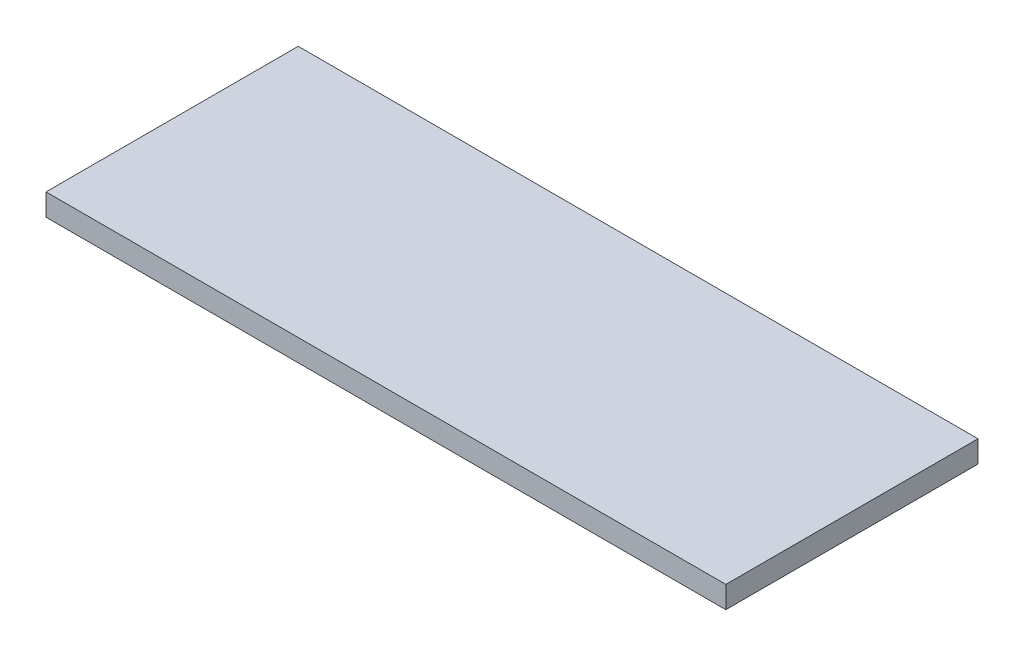
ISO-10303-21;
HEADER;
FILE_DESCRIPTION(('STEP AP214'),'2;1');
FILE_NAME('part.step','',(''),(''),'','','');
FILE_SCHEMA(('AUTOMOTIVE_DESIGN { 1 0 10303 214 1 1 1 1 }'));
ENDSEC;
DATA;
#1=APPLICATION_CONTEXT('core data for automotive mechanical design processes');
#2=APPLICATION_PROTOCOL_DEFINITION('international standard','automotive_design',2000,#1);
#3=PRODUCT_CONTEXT('',#1,'mechanical');
#4=PRODUCT('Part','Part','',(#3));
#5=PRODUCT_RELATED_PRODUCT_CATEGORY('part','',(#4));
#6=PRODUCT_DEFINITION_FORMATION('','',#4);
#7=PRODUCT_DEFINITION_CONTEXT('part definition',#1,'design');
#8=PRODUCT_DEFINITION('design','',#6,#7);
#9=PRODUCT_DEFINITION_SHAPE('','',#8);
#10=(LENGTH_UNIT() NAMED_UNIT(*) SI_UNIT(.MILLI.,.METRE.));
#11=(NAMED_UNIT(*) PLANE_ANGLE_UNIT() SI_UNIT($,.RADIAN.));
#12=(NAMED_UNIT(*) SI_UNIT($,.STERADIAN.) SOLID_ANGLE_UNIT());
#13=UNCERTAINTY_MEASURE_WITH_UNIT(LENGTH_MEASURE(1.E-05),#10,'distance_accuracy_value','');
#14=(GEOMETRIC_REPRESENTATION_CONTEXT(3) GLOBAL_UNCERTAINTY_ASSIGNED_CONTEXT((#13)) GLOBAL_UNIT_ASSIGNED_CONTEXT((#10,
#11,#12)) REPRESENTATION_CONTEXT('',''));
#15=CARTESIAN_POINT('',(0.,0.,0.));
#16=DIRECTION('',(0.,0.,1.));
#17=DIRECTION('',(1.,0.,0.));
#18=AXIS2_PLACEMENT_3D('',#15,#16,#17);
#19=CARTESIAN_POINT('',(0.,10.,0.));
#20=DIRECTION('',(1.,0.,0.));
#21=DIRECTION('',(0.,0.,-1.));
#22=AXIS2_PLACEMENT_3D('',#19,#20,#21);
#23=PLANE('',#22);
#24=DIRECTION('',(0.,0.,1.));
#25=VECTOR('',#24,1.);
#26=CARTESIAN_POINT('',(0.,0.,0.));
#27=LINE('',#26,#25);
#28=CARTESIAN_POINT('',(0.,0.,-115.));
#29=VERTEX_POINT('',#28);
#30=CARTESIAN_POINT('',(0.,0.,0.));
#31=VERTEX_POINT('',#30);
#32=EDGE_CURVE('E107',#29,#31,#27,.T.);
#33=ORIENTED_EDGE('',*,*,#32,.T.);
#34=DIRECTION('',(0.,-1.,0.));
#35=VECTOR('',#34,1.);
#36=CARTESIAN_POINT('',(0.,10.,0.));
#37=LINE('',#36,#35);
#38=CARTESIAN_POINT('',(0.,10.,0.));
#39=VERTEX_POINT('',#38);
#40=EDGE_CURVE('E11',#39,#31,#37,.T.);
#41=ORIENTED_EDGE('',*,*,#40,.F.);
#42=DIRECTION('',(0.,0.,1.));
#43=VECTOR('',#42,1.);
#44=CARTESIAN_POINT('',(0.,10.,0.));
#45=LINE('',#44,#43);
#46=CARTESIAN_POINT('',(0.,10.,-115.));
#47=VERTEX_POINT('',#46);
#48=EDGE_CURVE('E91',#47,#39,#45,.T.);
#49=ORIENTED_EDGE('',*,*,#48,.F.);
#50=DIRECTION('',(0.,-1.,0.));
#51=VECTOR('',#50,1.);
#52=CARTESIAN_POINT('',(0.,10.,-115.));
#53=LINE('',#52,#51);
#54=EDGE_CURVE('E103',#47,#29,#53,.T.);
#55=ORIENTED_EDGE('',*,*,#54,.T.);
#56=EDGE_LOOP('',(#33,#41,#49,#55));
#57=FACE_BOUND('',#56,.T.);
#58=ADVANCED_FACE('F39',(#57),#23,.F.);
#59=CARTESIAN_POINT('',(0.,10.,0.));
#60=DIRECTION('',(0.,0.,-1.));
#61=DIRECTION('',(-1.,0.,0.));
#62=AXIS2_PLACEMENT_3D('',#59,#60,#61);
#63=PLANE('',#62);
#64=DIRECTION('',(1.,0.,0.));
#65=VECTOR('',#64,1.);
#66=CARTESIAN_POINT('',(0.,0.,0.));
#67=LINE('',#66,#65);
#68=CARTESIAN_POINT('',(310.,0.,0.));
#69=VERTEX_POINT('',#68);
#70=EDGE_CURVE('E96',#31,#69,#67,.T.);
#71=ORIENTED_EDGE('',*,*,#70,.T.);
#72=DIRECTION('',(0.,-1.,0.));
#73=VECTOR('',#72,1.);
#74=CARTESIAN_POINT('',(310.,10.,0.));
#75=LINE('',#74,#73);
#76=CARTESIAN_POINT('',(310.,10.,0.));
#77=VERTEX_POINT('',#76);
#78=EDGE_CURVE('E48',#77,#69,#75,.T.);
#79=ORIENTED_EDGE('',*,*,#78,.F.);
#80=DIRECTION('',(1.,0.,0.));
#81=VECTOR('',#80,1.);
#82=CARTESIAN_POINT('',(0.,10.,0.));
#83=LINE('',#82,#81);
#84=EDGE_CURVE('E86',#39,#77,#83,.T.);
#85=ORIENTED_EDGE('',*,*,#84,.F.);
#86=ORIENTED_EDGE('',*,*,#40,.T.);
#87=EDGE_LOOP('',(#71,#79,#85,#86));
#88=FACE_BOUND('',#87,.T.);
#89=ADVANCED_FACE('F95',(#88),#63,.F.);
#90=CARTESIAN_POINT('',(310.,10.,0.));
#91=DIRECTION('',(-1.,0.,0.));
#92=DIRECTION('',(0.,0.,1.));
#93=AXIS2_PLACEMENT_3D('',#90,#91,#92);
#94=PLANE('',#93);
#95=DIRECTION('',(0.,0.,-1.));
#96=VECTOR('',#95,1.);
#97=CARTESIAN_POINT('',(310.,0.,0.));
#98=LINE('',#97,#96);
#99=CARTESIAN_POINT('',(310.,0.,-115.));
#100=VERTEX_POINT('',#99);
#101=EDGE_CURVE('E73',#69,#100,#98,.T.);
#102=ORIENTED_EDGE('',*,*,#101,.T.);
#103=DIRECTION('',(0.,-1.,0.));
#104=VECTOR('',#103,1.);
#105=CARTESIAN_POINT('',(310.,10.,-115.));
#106=LINE('',#105,#104);
#107=CARTESIAN_POINT('',(310.,10.,-115.));
#108=VERTEX_POINT('',#107);
#109=EDGE_CURVE('E98',#108,#100,#106,.T.);
#110=ORIENTED_EDGE('',*,*,#109,.F.);
#111=DIRECTION('',(0.,0.,-1.));
#112=VECTOR('',#111,1.);
#113=CARTESIAN_POINT('',(310.,10.,0.));
#114=LINE('',#113,#112);
#115=EDGE_CURVE('E89',#77,#108,#114,.T.);
#116=ORIENTED_EDGE('',*,*,#115,.F.);
#117=ORIENTED_EDGE('',*,*,#78,.T.);
#118=EDGE_LOOP('',(#102,#110,#116,#117));
#119=FACE_BOUND('',#118,.T.);
#120=ADVANCED_FACE('F99',(#119),#94,.F.);
#121=CARTESIAN_POINT('',(0.,10.,-115.));
#122=DIRECTION('',(0.,0.,1.));
#123=DIRECTION('',(1.,0.,0.));
#124=AXIS2_PLACEMENT_3D('',#121,#122,#123);
#125=PLANE('',#124);
#126=DIRECTION('',(-1.,0.,0.));
#127=VECTOR('',#126,1.);
#128=CARTESIAN_POINT('',(0.,0.,-115.));
#129=LINE('',#128,#127);
#130=EDGE_CURVE('E79',#100,#29,#129,.T.);
#131=ORIENTED_EDGE('',*,*,#130,.T.);
#132=ORIENTED_EDGE('',*,*,#54,.F.);
#133=DIRECTION('',(-1.,0.,0.));
#134=VECTOR('',#133,1.);
#135=CARTESIAN_POINT('',(0.,10.,-115.));
#136=LINE('',#135,#134);
#137=EDGE_CURVE('E56',#108,#47,#136,.T.);
#138=ORIENTED_EDGE('',*,*,#137,.F.);
#139=ORIENTED_EDGE('',*,*,#109,.T.);
#140=EDGE_LOOP('',(#131,#132,#138,#139));
#141=FACE_BOUND('',#140,.T.);
#142=ADVANCED_FACE('F120',(#141),#125,.F.);
#143=CARTESIAN_POINT('',(0.,10.,0.));
#144=DIRECTION('',(0.,-1.,0.));
#145=DIRECTION('',(0.,0.,-1.));
#146=AXIS2_PLACEMENT_3D('',#143,#144,#145);
#147=PLANE('',#146);
#148=ORIENTED_EDGE('',*,*,#48,.T.);
#149=ORIENTED_EDGE('',*,*,#84,.T.);
#150=ORIENTED_EDGE('',*,*,#115,.T.);
#151=ORIENTED_EDGE('',*,*,#137,.T.);
#152=EDGE_LOOP('',(#148,#149,#150,#151));
#153=FACE_BOUND('',#152,.T.);
#154=ADVANCED_FACE('F87',(#153),#147,.F.);
#155=CARTESIAN_POINT('',(0.,0.,0.));
#156=DIRECTION('',(0.,-1.,0.));
#157=DIRECTION('',(0.,0.,-1.));
#158=AXIS2_PLACEMENT_3D('',#155,#156,#157);
#159=PLANE('',#158);
#160=ORIENTED_EDGE('',*,*,#32,.F.);
#161=ORIENTED_EDGE('',*,*,#130,.F.);
#162=ORIENTED_EDGE('',*,*,#101,.F.);
#163=ORIENTED_EDGE('',*,*,#70,.F.);
#164=EDGE_LOOP('',(#160,#161,#162,#163));
#165=FACE_BOUND('',#164,.T.);
#166=ADVANCED_FACE('F123',(#165),#159,.T.);
#167=CLOSED_SHELL('',(#58,#89,#120,#142,#154,#166));
#168=MANIFOLD_SOLID_BREP('B2',#167);
#169=ADVANCED_BREP_SHAPE_REPRESENTATION('',(#18,#168),#14);
#170=SHAPE_DEFINITION_REPRESENTATION(#9,#169);
ENDSEC;
END-ISO-10303-21;
